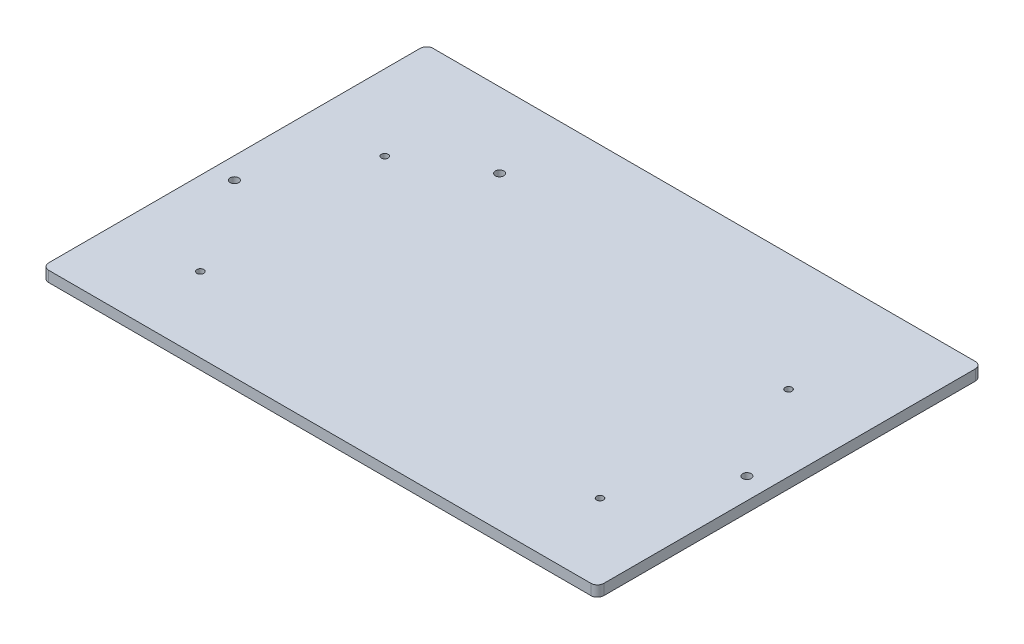
ISO-10303-21;
HEADER;
FILE_DESCRIPTION(('STEP AP214'),'2;1');
FILE_NAME('part.step','',(''),(''),'','','');
FILE_SCHEMA(('AUTOMOTIVE_DESIGN { 1 0 10303 214 1 1 1 1 }'));
ENDSEC;
DATA;
#1=APPLICATION_CONTEXT('core data for automotive mechanical design processes');
#2=APPLICATION_PROTOCOL_DEFINITION('international standard','automotive_design',2000,#1);
#3=PRODUCT_CONTEXT('',#1,'mechanical');
#4=PRODUCT('Part','Part','',(#3));
#5=PRODUCT_RELATED_PRODUCT_CATEGORY('part','',(#4));
#6=PRODUCT_DEFINITION_FORMATION('','',#4);
#7=PRODUCT_DEFINITION_CONTEXT('part definition',#1,'design');
#8=PRODUCT_DEFINITION('design','',#6,#7);
#9=PRODUCT_DEFINITION_SHAPE('','',#8);
#10=(LENGTH_UNIT() NAMED_UNIT(*) SI_UNIT(.MILLI.,.METRE.));
#11=(NAMED_UNIT(*) PLANE_ANGLE_UNIT() SI_UNIT($,.RADIAN.));
#12=(NAMED_UNIT(*) SI_UNIT($,.STERADIAN.) SOLID_ANGLE_UNIT());
#13=UNCERTAINTY_MEASURE_WITH_UNIT(LENGTH_MEASURE(1.E-05),#10,'distance_accuracy_value','');
#14=(GEOMETRIC_REPRESENTATION_CONTEXT(3) GLOBAL_UNCERTAINTY_ASSIGNED_CONTEXT((#13)) GLOBAL_UNIT_ASSIGNED_CONTEXT((#10,
#11,#12)) REPRESENTATION_CONTEXT('',''));
#15=CARTESIAN_POINT('',(0.,0.,0.));
#16=DIRECTION('',(0.,0.,1.));
#17=DIRECTION('',(1.,0.,0.));
#18=AXIS2_PLACEMENT_3D('',#15,#16,#17);
#19=CARTESIAN_POINT('',(0.,5.,0.));
#20=DIRECTION('',(0.,1.,0.));
#21=DIRECTION('',(0.,0.,1.));
#22=AXIS2_PLACEMENT_3D('',#19,#20,#21);
#23=PLANE('',#22);
#24=CARTESIAN_POINT('',(-114.970238095238,5.,35.8827774203236));
#25=DIRECTION('',(0.,1.,0.));
#26=DIRECTION('',(0.,0.,1.));
#27=AXIS2_PLACEMENT_3D('',#24,#25,#26);
#28=CIRCLE('',#27,2.);
#29=CARTESIAN_POINT('',(-114.970238095238,5.,37.8827774203236));
#30=VERTEX_POINT('',#29);
#31=EDGE_CURVE('E206',#30,#30,#28,.T.);
#32=ORIENTED_EDGE('',*,*,#31,.F.);
#33=EDGE_LOOP('',(#32));
#34=FACE_BOUND('',#33,.T.);
#35=CARTESIAN_POINT('',(99.5797619047619,5.,79.2000915178569));
#36=DIRECTION('',(0.,1.,0.));
#37=DIRECTION('',(0.,0.,1.));
#38=AXIS2_PLACEMENT_3D('',#35,#36,#37);
#39=CIRCLE('',#38,1.60000000000001);
#40=CARTESIAN_POINT('',(99.5797619047619,5.,80.8000915178569));
#41=VERTEX_POINT('',#40);
#42=EDGE_CURVE('E194',#41,#41,#39,.T.);
#43=ORIENTED_EDGE('',*,*,#42,.F.);
#44=EDGE_LOOP('',(#43));
#45=FACE_BOUND('',#44,.T.);
#46=CARTESIAN_POINT('',(99.5797619047619,5.,-9.07722257967636));
#47=DIRECTION('',(0.,1.,0.));
#48=DIRECTION('',(0.,0.,1.));
#49=AXIS2_PLACEMENT_3D('',#46,#47,#48);
#50=CIRCLE('',#49,1.6);
#51=CARTESIAN_POINT('',(99.5797619047619,5.,-7.47722257967636));
#52=VERTEX_POINT('',#51);
#53=EDGE_CURVE('E183',#52,#52,#50,.T.);
#54=ORIENTED_EDGE('',*,*,#53,.F.);
#55=EDGE_LOOP('',(#54));
#56=FACE_BOUND('',#55,.T.);
#57=DIRECTION('',(-1.,0.,0.));
#58=VECTOR('',#57,1.);
#59=CARTESIAN_POINT('',(-124.970238095238,5.,-64.1172225796764));
#60=LINE('',#59,#58);
#61=CARTESIAN_POINT('',(132.029761904762,5.,-64.1172225796764));
#62=VERTEX_POINT('',#61);
#63=CARTESIAN_POINT('',(-121.970238095238,5.,-64.1172225796764));
#64=VERTEX_POINT('',#63);
#65=EDGE_CURVE('E138',#62,#64,#60,.T.);
#66=ORIENTED_EDGE('',*,*,#65,.T.);
#67=CARTESIAN_POINT('',(-121.970238095238,5.,-61.1172225796764));
#68=DIRECTION('',(0.,1.,0.));
#69=DIRECTION('',(0.,0.,1.));
#70=AXIS2_PLACEMENT_3D('',#67,#68,#69);
#71=CIRCLE('',#70,3.);
#72=CARTESIAN_POINT('',(-124.970238095238,5.,-61.1172225796764));
#73=VERTEX_POINT('',#72);
#74=EDGE_CURVE('E157',#64,#73,#71,.T.);
#75=ORIENTED_EDGE('',*,*,#74,.T.);
#76=DIRECTION('',(0.,0.,1.));
#77=VECTOR('',#76,1.);
#78=CARTESIAN_POINT('',(-124.970238095238,5.,-64.1172225796764));
#79=LINE('',#78,#77);
#80=CARTESIAN_POINT('',(-124.970238095238,5.,112.882777420324));
#81=VERTEX_POINT('',#80);
#82=EDGE_CURVE('E121',#73,#81,#79,.T.);
#83=ORIENTED_EDGE('',*,*,#82,.T.);
#84=CARTESIAN_POINT('',(-121.970238095238,5.,112.882777420324));
#85=DIRECTION('',(0.,1.,0.));
#86=DIRECTION('',(0.,0.,1.));
#87=AXIS2_PLACEMENT_3D('',#84,#85,#86);
#88=CIRCLE('',#87,3.);
#89=CARTESIAN_POINT('',(-121.970238095238,5.,115.882777420324));
#90=VERTEX_POINT('',#89);
#91=EDGE_CURVE('E152',#81,#90,#88,.T.);
#92=ORIENTED_EDGE('',*,*,#91,.T.);
#93=DIRECTION('',(1.,0.,0.));
#94=VECTOR('',#93,1.);
#95=CARTESIAN_POINT('',(-124.970238095238,5.,115.882777420324));
#96=LINE('',#95,#94);
#97=CARTESIAN_POINT('',(132.029761904762,5.,115.882777420324));
#98=VERTEX_POINT('',#97);
#99=EDGE_CURVE('E168',#90,#98,#96,.T.);
#100=ORIENTED_EDGE('',*,*,#99,.T.);
#101=CARTESIAN_POINT('',(132.029761904762,5.,112.882777420324));
#102=DIRECTION('',(0.,1.,0.));
#103=DIRECTION('',(0.,0.,1.));
#104=AXIS2_PLACEMENT_3D('',#101,#102,#103);
#105=CIRCLE('',#104,3.);
#106=CARTESIAN_POINT('',(135.029761904762,5.,112.882777420324));
#107=VERTEX_POINT('',#106);
#108=EDGE_CURVE('E57',#98,#107,#105,.T.);
#109=ORIENTED_EDGE('',*,*,#108,.T.);
#110=DIRECTION('',(0.,0.,-1.));
#111=VECTOR('',#110,1.);
#112=CARTESIAN_POINT('',(135.029761904762,5.,-64.1172225796764));
#113=LINE('',#112,#111);
#114=CARTESIAN_POINT('',(135.029761904762,5.,-61.1172225796764));
#115=VERTEX_POINT('',#114);
#116=EDGE_CURVE('E176',#107,#115,#113,.T.);
#117=ORIENTED_EDGE('',*,*,#116,.T.);
#118=CARTESIAN_POINT('',(132.029761904762,5.,-61.1172225796764));
#119=DIRECTION('',(0.,1.,0.));
#120=DIRECTION('',(0.,0.,1.));
#121=AXIS2_PLACEMENT_3D('',#118,#119,#120);
#122=CIRCLE('',#121,3.);
#123=EDGE_CURVE('E155',#115,#62,#122,.T.);
#124=ORIENTED_EDGE('',*,*,#123,.T.);
#125=EDGE_LOOP('',(#66,#75,#83,#92,#100,#109,#117,#124));
#126=FACE_BOUND('',#125,.T.);
#127=CARTESIAN_POINT('',(-89.5202380952381,5.,-9.07722257967636));
#128=DIRECTION('',(0.,1.,0.));
#129=DIRECTION('',(0.,0.,1.));
#130=AXIS2_PLACEMENT_3D('',#127,#128,#129);
#131=CIRCLE('',#130,1.6);
#132=CARTESIAN_POINT('',(-89.5202380952381,5.,-7.47722257967636));
#133=VERTEX_POINT('',#132);
#134=EDGE_CURVE('E129',#133,#133,#131,.T.);
#135=ORIENTED_EDGE('',*,*,#134,.F.);
#136=EDGE_LOOP('',(#135));
#137=FACE_BOUND('',#136,.T.);
#138=CARTESIAN_POINT('',(-85.9302380952381,5.,80.8427774203236));
#139=DIRECTION('',(0.,1.,0.));
#140=DIRECTION('',(0.,0.,1.));
#141=AXIS2_PLACEMENT_3D('',#138,#139,#140);
#142=CIRCLE('',#141,1.60000000000001);
#143=CARTESIAN_POINT('',(-85.9302380952381,5.,82.4427774203237));
#144=VERTEX_POINT('',#143);
#145=EDGE_CURVE('E188',#144,#144,#142,.T.);
#146=ORIENTED_EDGE('',*,*,#145,.F.);
#147=EDGE_LOOP('',(#146));
#148=FACE_BOUND('',#147,.T.);
#149=CARTESIAN_POINT('',(-55.6396803922752,5.,-28.9873915760612));
#150=DIRECTION('',(0.,1.,0.));
#151=DIRECTION('',(0.,0.,1.));
#152=AXIS2_PLACEMENT_3D('',#149,#150,#151);
#153=CIRCLE('',#152,2.);
#154=CARTESIAN_POINT('',(-55.6396803922752,5.,-26.9873915760612));
#155=VERTEX_POINT('',#154);
#156=EDGE_CURVE('E200',#155,#155,#153,.T.);
#157=ORIENTED_EDGE('',*,*,#156,.F.);
#158=EDGE_LOOP('',(#157));
#159=FACE_BOUND('',#158,.T.);
#160=CARTESIAN_POINT('',(125.029761904762,5.,35.8827774203236));
#161=DIRECTION('',(0.,1.,0.));
#162=DIRECTION('',(0.,0.,1.));
#163=AXIS2_PLACEMENT_3D('',#160,#161,#162);
#164=CIRCLE('',#163,2.);
#165=CARTESIAN_POINT('',(125.029761904762,5.,37.8827774203236));
#166=VERTEX_POINT('',#165);
#167=EDGE_CURVE('E212',#166,#166,#164,.T.);
#168=ORIENTED_EDGE('',*,*,#167,.F.);
#169=EDGE_LOOP('',(#168));
#170=FACE_BOUND('',#169,.T.);
#171=ADVANCED_FACE('F35',(#34,#45,#56,#126,#137,#148,#159,#170),#23,.T.);
#172=CARTESIAN_POINT('',(0.,0.,0.));
#173=DIRECTION('',(0.,1.,0.));
#174=DIRECTION('',(0.,0.,1.));
#175=AXIS2_PLACEMENT_3D('',#172,#173,#174);
#176=PLANE('',#175);
#177=DIRECTION('',(0.,0.,1.));
#178=VECTOR('',#177,1.);
#179=CARTESIAN_POINT('',(-124.970238095238,0.,-64.1172225796764));
#180=LINE('',#179,#178);
#181=CARTESIAN_POINT('',(-124.970238095238,0.,-61.1172225796764));
#182=VERTEX_POINT('',#181);
#183=CARTESIAN_POINT('',(-124.970238095238,0.,112.882777420324));
#184=VERTEX_POINT('',#183);
#185=EDGE_CURVE('E118',#182,#184,#180,.T.);
#186=ORIENTED_EDGE('',*,*,#185,.F.);
#187=CARTESIAN_POINT('',(-121.970238095238,0.,-61.1172225796764));
#188=DIRECTION('',(0.,1.,0.));
#189=DIRECTION('',(0.,0.,1.));
#190=AXIS2_PLACEMENT_3D('',#187,#188,#189);
#191=CIRCLE('',#190,3.);
#192=CARTESIAN_POINT('',(-121.970238095238,0.,-64.1172225796764));
#193=VERTEX_POINT('',#192);
#194=EDGE_CURVE('E101',#182,#193,#191,.F.);
#195=ORIENTED_EDGE('',*,*,#194,.T.);
#196=DIRECTION('',(-1.,0.,0.));
#197=VECTOR('',#196,1.);
#198=CARTESIAN_POINT('',(-124.970238095238,0.,-64.1172225796764));
#199=LINE('',#198,#197);
#200=CARTESIAN_POINT('',(132.029761904762,0.,-64.1172225796764));
#201=VERTEX_POINT('',#200);
#202=EDGE_CURVE('E142',#201,#193,#199,.T.);
#203=ORIENTED_EDGE('',*,*,#202,.F.);
#204=CARTESIAN_POINT('',(132.029761904762,0.,-61.1172225796764));
#205=DIRECTION('',(0.,1.,0.));
#206=DIRECTION('',(0.,0.,1.));
#207=AXIS2_PLACEMENT_3D('',#204,#205,#206);
#208=CIRCLE('',#207,3.);
#209=CARTESIAN_POINT('',(135.029761904762,0.,-61.1172225796764));
#210=VERTEX_POINT('',#209);
#211=EDGE_CURVE('E112',#201,#210,#208,.F.);
#212=ORIENTED_EDGE('',*,*,#211,.T.);
#213=DIRECTION('',(0.,0.,-1.));
#214=VECTOR('',#213,1.);
#215=CARTESIAN_POINT('',(135.029761904762,0.,-64.1172225796764));
#216=LINE('',#215,#214);
#217=CARTESIAN_POINT('',(135.029761904762,0.,112.882777420324));
#218=VERTEX_POINT('',#217);
#219=EDGE_CURVE('E132',#218,#210,#216,.T.);
#220=ORIENTED_EDGE('',*,*,#219,.F.);
#221=CARTESIAN_POINT('',(132.029761904762,0.,112.882777420324));
#222=DIRECTION('',(0.,1.,0.));
#223=DIRECTION('',(0.,0.,1.));
#224=AXIS2_PLACEMENT_3D('',#221,#222,#223);
#225=CIRCLE('',#224,3.);
#226=CARTESIAN_POINT('',(132.029761904762,0.,115.882777420324));
#227=VERTEX_POINT('',#226);
#228=EDGE_CURVE('E146',#218,#227,#225,.F.);
#229=ORIENTED_EDGE('',*,*,#228,.T.);
#230=DIRECTION('',(1.,0.,0.));
#231=VECTOR('',#230,1.);
#232=CARTESIAN_POINT('',(-124.970238095238,0.,115.882777420324));
#233=LINE('',#232,#231);
#234=CARTESIAN_POINT('',(-121.970238095238,0.,115.882777420324));
#235=VERTEX_POINT('',#234);
#236=EDGE_CURVE('E128',#235,#227,#233,.T.);
#237=ORIENTED_EDGE('',*,*,#236,.F.);
#238=CARTESIAN_POINT('',(-121.970238095238,0.,112.882777420324));
#239=DIRECTION('',(0.,1.,0.));
#240=DIRECTION('',(0.,0.,1.));
#241=AXIS2_PLACEMENT_3D('',#238,#239,#240);
#242=CIRCLE('',#241,3.);
#243=EDGE_CURVE('E122',#235,#184,#242,.F.);
#244=ORIENTED_EDGE('',*,*,#243,.T.);
#245=EDGE_LOOP('',(#186,#195,#203,#212,#220,#229,#237,#244));
#246=FACE_BOUND('',#245,.T.);
#247=CARTESIAN_POINT('',(-89.5202380952381,0.,-9.07722257967636));
#248=DIRECTION('',(0.,1.,0.));
#249=DIRECTION('',(0.,0.,1.));
#250=AXIS2_PLACEMENT_3D('',#247,#248,#249);
#251=CIRCLE('',#250,1.6);
#252=CARTESIAN_POINT('',(-89.5202380952381,0.,-7.47722257967636));
#253=VERTEX_POINT('',#252);
#254=EDGE_CURVE('E135',#253,#253,#251,.T.);
#255=ORIENTED_EDGE('',*,*,#254,.T.);
#256=EDGE_LOOP('',(#255));
#257=FACE_BOUND('',#256,.T.);
#258=CARTESIAN_POINT('',(99.5797619047619,0.,-9.07722257967636));
#259=DIRECTION('',(0.,1.,0.));
#260=DIRECTION('',(0.,0.,1.));
#261=AXIS2_PLACEMENT_3D('',#258,#259,#260);
#262=CIRCLE('',#261,1.6);
#263=CARTESIAN_POINT('',(99.5797619047619,0.,-7.47722257967636));
#264=VERTEX_POINT('',#263);
#265=EDGE_CURVE('E185',#264,#264,#262,.T.);
#266=ORIENTED_EDGE('',*,*,#265,.T.);
#267=EDGE_LOOP('',(#266));
#268=FACE_BOUND('',#267,.T.);
#269=CARTESIAN_POINT('',(-85.9302380952381,0.,80.8427774203236));
#270=DIRECTION('',(0.,1.,0.));
#271=DIRECTION('',(0.,0.,1.));
#272=AXIS2_PLACEMENT_3D('',#269,#270,#271);
#273=CIRCLE('',#272,1.60000000000001);
#274=CARTESIAN_POINT('',(-85.9302380952381,0.,82.4427774203237));
#275=VERTEX_POINT('',#274);
#276=EDGE_CURVE('E191',#275,#275,#273,.T.);
#277=ORIENTED_EDGE('',*,*,#276,.T.);
#278=EDGE_LOOP('',(#277));
#279=FACE_BOUND('',#278,.T.);
#280=CARTESIAN_POINT('',(99.5797619047619,0.,79.2000915178569));
#281=DIRECTION('',(0.,1.,0.));
#282=DIRECTION('',(0.,0.,1.));
#283=AXIS2_PLACEMENT_3D('',#280,#281,#282);
#284=CIRCLE('',#283,1.60000000000001);
#285=CARTESIAN_POINT('',(99.5797619047619,0.,80.8000915178569));
#286=VERTEX_POINT('',#285);
#287=EDGE_CURVE('E197',#286,#286,#284,.T.);
#288=ORIENTED_EDGE('',*,*,#287,.T.);
#289=EDGE_LOOP('',(#288));
#290=FACE_BOUND('',#289,.T.);
#291=CARTESIAN_POINT('',(-55.6396803922752,0.,-28.9873915760612));
#292=DIRECTION('',(0.,1.,0.));
#293=DIRECTION('',(0.,0.,1.));
#294=AXIS2_PLACEMENT_3D('',#291,#292,#293);
#295=CIRCLE('',#294,2.);
#296=CARTESIAN_POINT('',(-55.6396803922752,0.,-26.9873915760612));
#297=VERTEX_POINT('',#296);
#298=EDGE_CURVE('E203',#297,#297,#295,.T.);
#299=ORIENTED_EDGE('',*,*,#298,.T.);
#300=EDGE_LOOP('',(#299));
#301=FACE_BOUND('',#300,.T.);
#302=CARTESIAN_POINT('',(-114.970238095238,0.,35.8827774203236));
#303=DIRECTION('',(0.,1.,0.));
#304=DIRECTION('',(0.,0.,1.));
#305=AXIS2_PLACEMENT_3D('',#302,#303,#304);
#306=CIRCLE('',#305,2.);
#307=CARTESIAN_POINT('',(-114.970238095238,0.,37.8827774203236));
#308=VERTEX_POINT('',#307);
#309=EDGE_CURVE('E209',#308,#308,#306,.T.);
#310=ORIENTED_EDGE('',*,*,#309,.T.);
#311=EDGE_LOOP('',(#310));
#312=FACE_BOUND('',#311,.T.);
#313=CARTESIAN_POINT('',(125.029761904762,0.,35.8827774203236));
#314=DIRECTION('',(0.,1.,0.));
#315=DIRECTION('',(0.,0.,1.));
#316=AXIS2_PLACEMENT_3D('',#313,#314,#315);
#317=CIRCLE('',#316,2.);
#318=CARTESIAN_POINT('',(125.029761904762,0.,37.8827774203236));
#319=VERTEX_POINT('',#318);
#320=EDGE_CURVE('E215',#319,#319,#317,.T.);
#321=ORIENTED_EDGE('',*,*,#320,.T.);
#322=EDGE_LOOP('',(#321));
#323=FACE_BOUND('',#322,.T.);
#324=ADVANCED_FACE('F125',(#246,#257,#268,#279,#290,#301,#312,#323),#176,.F.);
#325=CARTESIAN_POINT('',(-124.970238095238,5.,-64.1172225796764));
#326=DIRECTION('',(1.,0.,0.));
#327=DIRECTION('',(0.,0.,-1.));
#328=AXIS2_PLACEMENT_3D('',#325,#326,#327);
#329=PLANE('',#328);
#330=ORIENTED_EDGE('',*,*,#82,.F.);
#331=DIRECTION('',(0.,-1.,0.));
#332=VECTOR('',#331,1.);
#333=CARTESIAN_POINT('',(-124.970238095238,5.,-61.1172225796764));
#334=LINE('',#333,#332);
#335=EDGE_CURVE('E105',#73,#182,#334,.T.);
#336=ORIENTED_EDGE('',*,*,#335,.T.);
#337=ORIENTED_EDGE('',*,*,#185,.T.);
#338=DIRECTION('',(0.,-1.,0.));
#339=VECTOR('',#338,1.);
#340=CARTESIAN_POINT('',(-124.970238095238,5.,112.882777420324));
#341=LINE('',#340,#339);
#342=EDGE_CURVE('E123',#184,#81,#341,.F.);
#343=ORIENTED_EDGE('',*,*,#342,.T.);
#344=EDGE_LOOP('',(#330,#336,#337,#343));
#345=FACE_BOUND('',#344,.T.);
#346=ADVANCED_FACE('F117',(#345),#329,.F.);
#347=CARTESIAN_POINT('',(-124.970238095238,5.,115.882777420324));
#348=DIRECTION('',(0.,0.,-1.));
#349=DIRECTION('',(-1.,0.,0.));
#350=AXIS2_PLACEMENT_3D('',#347,#348,#349);
#351=PLANE('',#350);
#352=ORIENTED_EDGE('',*,*,#236,.T.);
#353=DIRECTION('',(0.,-1.,0.));
#354=VECTOR('',#353,1.);
#355=CARTESIAN_POINT('',(132.029761904762,5.,115.882777420324));
#356=LINE('',#355,#354);
#357=EDGE_CURVE('E11',#227,#98,#356,.F.);
#358=ORIENTED_EDGE('',*,*,#357,.T.);
#359=ORIENTED_EDGE('',*,*,#99,.F.);
#360=DIRECTION('',(0.,-1.,0.));
#361=VECTOR('',#360,1.);
#362=CARTESIAN_POINT('',(-121.970238095238,5.,115.882777420324));
#363=LINE('',#362,#361);
#364=EDGE_CURVE('E43',#90,#235,#363,.T.);
#365=ORIENTED_EDGE('',*,*,#364,.T.);
#366=EDGE_LOOP('',(#352,#358,#359,#365));
#367=FACE_BOUND('',#366,.T.);
#368=ADVANCED_FACE('F166',(#367),#351,.F.);
#369=CARTESIAN_POINT('',(135.029761904762,5.,-64.1172225796764));
#370=DIRECTION('',(-1.,0.,0.));
#371=DIRECTION('',(0.,0.,1.));
#372=AXIS2_PLACEMENT_3D('',#369,#370,#371);
#373=PLANE('',#372);
#374=ORIENTED_EDGE('',*,*,#219,.T.);
#375=DIRECTION('',(0.,-1.,0.));
#376=VECTOR('',#375,1.);
#377=CARTESIAN_POINT('',(135.029761904762,5.,-61.1172225796764));
#378=LINE('',#377,#376);
#379=EDGE_CURVE('E50',#210,#115,#378,.F.);
#380=ORIENTED_EDGE('',*,*,#379,.T.);
#381=ORIENTED_EDGE('',*,*,#116,.F.);
#382=DIRECTION('',(0.,-1.,0.));
#383=VECTOR('',#382,1.);
#384=CARTESIAN_POINT('',(135.029761904762,5.,112.882777420324));
#385=LINE('',#384,#383);
#386=EDGE_CURVE('E159',#107,#218,#385,.T.);
#387=ORIENTED_EDGE('',*,*,#386,.T.);
#388=EDGE_LOOP('',(#374,#380,#381,#387));
#389=FACE_BOUND('',#388,.T.);
#390=ADVANCED_FACE('F175',(#389),#373,.F.);
#391=CARTESIAN_POINT('',(-124.970238095238,5.,-64.1172225796764));
#392=DIRECTION('',(0.,0.,1.));
#393=DIRECTION('',(1.,0.,0.));
#394=AXIS2_PLACEMENT_3D('',#391,#392,#393);
#395=PLANE('',#394);
#396=ORIENTED_EDGE('',*,*,#202,.T.);
#397=DIRECTION('',(0.,-1.,0.));
#398=VECTOR('',#397,1.);
#399=CARTESIAN_POINT('',(-121.970238095238,5.,-64.1172225796764));
#400=LINE('',#399,#398);
#401=EDGE_CURVE('E106',#193,#64,#400,.F.);
#402=ORIENTED_EDGE('',*,*,#401,.T.);
#403=ORIENTED_EDGE('',*,*,#65,.F.);
#404=DIRECTION('',(0.,-1.,0.));
#405=VECTOR('',#404,1.);
#406=CARTESIAN_POINT('',(132.029761904762,5.,-64.1172225796764));
#407=LINE('',#406,#405);
#408=EDGE_CURVE('E111',#62,#201,#407,.T.);
#409=ORIENTED_EDGE('',*,*,#408,.T.);
#410=EDGE_LOOP('',(#396,#402,#403,#409));
#411=FACE_BOUND('',#410,.T.);
#412=ADVANCED_FACE('F237',(#411),#395,.F.);
#413=CARTESIAN_POINT('',(-89.5202380952381,5.,-9.07722257967636));
#414=DIRECTION('',(0.,-1.,0.));
#415=DIRECTION('',(0.,0.,-1.));
#416=AXIS2_PLACEMENT_3D('',#413,#414,#415);
#417=CYLINDRICAL_SURFACE('',#416,1.6);
#418=ORIENTED_EDGE('',*,*,#134,.T.);
#419=EDGE_LOOP('',(#418));
#420=FACE_BOUND('',#419,.T.);
#421=ORIENTED_EDGE('',*,*,#254,.F.);
#422=EDGE_LOOP('',(#421));
#423=FACE_BOUND('',#422,.T.);
#424=ADVANCED_FACE('F234',(#420,#423),#417,.F.);
#425=CARTESIAN_POINT('',(99.5797619047619,5.,-9.07722257967636));
#426=DIRECTION('',(0.,-1.,0.));
#427=DIRECTION('',(0.,0.,-1.));
#428=AXIS2_PLACEMENT_3D('',#425,#426,#427);
#429=CYLINDRICAL_SURFACE('',#428,1.6);
#430=ORIENTED_EDGE('',*,*,#53,.T.);
#431=EDGE_LOOP('',(#430));
#432=FACE_BOUND('',#431,.T.);
#433=ORIENTED_EDGE('',*,*,#265,.F.);
#434=EDGE_LOOP('',(#433));
#435=FACE_BOUND('',#434,.T.);
#436=ADVANCED_FACE('F292',(#432,#435),#429,.F.);
#437=CARTESIAN_POINT('',(-85.9302380952381,5.,80.8427774203236));
#438=DIRECTION('',(0.,-1.,0.));
#439=DIRECTION('',(0.,0.,-1.));
#440=AXIS2_PLACEMENT_3D('',#437,#438,#439);
#441=CYLINDRICAL_SURFACE('',#440,1.60000000000001);
#442=ORIENTED_EDGE('',*,*,#145,.T.);
#443=EDGE_LOOP('',(#442));
#444=FACE_BOUND('',#443,.T.);
#445=ORIENTED_EDGE('',*,*,#276,.F.);
#446=EDGE_LOOP('',(#445));
#447=FACE_BOUND('',#446,.T.);
#448=ADVANCED_FACE('F289',(#444,#447),#441,.F.);
#449=CARTESIAN_POINT('',(99.5797619047619,5.,79.2000915178569));
#450=DIRECTION('',(0.,-1.,0.));
#451=DIRECTION('',(0.,0.,-1.));
#452=AXIS2_PLACEMENT_3D('',#449,#450,#451);
#453=CYLINDRICAL_SURFACE('',#452,1.60000000000001);
#454=ORIENTED_EDGE('',*,*,#42,.T.);
#455=EDGE_LOOP('',(#454));
#456=FACE_BOUND('',#455,.T.);
#457=ORIENTED_EDGE('',*,*,#287,.F.);
#458=EDGE_LOOP('',(#457));
#459=FACE_BOUND('',#458,.T.);
#460=ADVANCED_FACE('F271',(#456,#459),#453,.F.);
#461=CARTESIAN_POINT('',(-55.6396803922752,5.,-28.9873915760612));
#462=DIRECTION('',(0.,-1.,0.));
#463=DIRECTION('',(0.,0.,-1.));
#464=AXIS2_PLACEMENT_3D('',#461,#462,#463);
#465=CYLINDRICAL_SURFACE('',#464,2.);
#466=ORIENTED_EDGE('',*,*,#156,.T.);
#467=EDGE_LOOP('',(#466));
#468=FACE_BOUND('',#467,.T.);
#469=ORIENTED_EDGE('',*,*,#298,.F.);
#470=EDGE_LOOP('',(#469));
#471=FACE_BOUND('',#470,.T.);
#472=ADVANCED_FACE('F267',(#468,#471),#465,.F.);
#473=CARTESIAN_POINT('',(-114.970238095238,5.,35.8827774203236));
#474=DIRECTION('',(0.,-1.,0.));
#475=DIRECTION('',(0.,0.,-1.));
#476=AXIS2_PLACEMENT_3D('',#473,#474,#475);
#477=CYLINDRICAL_SURFACE('',#476,2.);
#478=ORIENTED_EDGE('',*,*,#31,.T.);
#479=EDGE_LOOP('',(#478));
#480=FACE_BOUND('',#479,.T.);
#481=ORIENTED_EDGE('',*,*,#309,.F.);
#482=EDGE_LOOP('',(#481));
#483=FACE_BOUND('',#482,.T.);
#484=ADVANCED_FACE('F270',(#480,#483),#477,.F.);
#485=CARTESIAN_POINT('',(125.029761904762,5.,35.8827774203236));
#486=DIRECTION('',(0.,-1.,0.));
#487=DIRECTION('',(0.,0.,-1.));
#488=AXIS2_PLACEMENT_3D('',#485,#486,#487);
#489=CYLINDRICAL_SURFACE('',#488,2.);
#490=ORIENTED_EDGE('',*,*,#167,.T.);
#491=EDGE_LOOP('',(#490));
#492=FACE_BOUND('',#491,.T.);
#493=ORIENTED_EDGE('',*,*,#320,.F.);
#494=EDGE_LOOP('',(#493));
#495=FACE_BOUND('',#494,.T.);
#496=ADVANCED_FACE('F221',(#492,#495),#489,.F.);
#497=CARTESIAN_POINT('',(-121.970238095238,5.,-61.1172225796764));
#498=DIRECTION('',(0.,-1.,0.));
#499=DIRECTION('',(0.,0.,-1.));
#500=AXIS2_PLACEMENT_3D('',#497,#498,#499);
#501=CYLINDRICAL_SURFACE('',#500,3.);
#502=ORIENTED_EDGE('',*,*,#74,.F.);
#503=ORIENTED_EDGE('',*,*,#401,.F.);
#504=ORIENTED_EDGE('',*,*,#194,.F.);
#505=ORIENTED_EDGE('',*,*,#335,.F.);
#506=EDGE_LOOP('',(#502,#503,#504,#505));
#507=FACE_BOUND('',#506,.T.);
#508=ADVANCED_FACE('F104',(#507),#501,.T.);
#509=CARTESIAN_POINT('',(132.029761904762,5.,-61.1172225796764));
#510=DIRECTION('',(0.,-1.,0.));
#511=DIRECTION('',(0.,0.,-1.));
#512=AXIS2_PLACEMENT_3D('',#509,#510,#511);
#513=CYLINDRICAL_SURFACE('',#512,3.);
#514=ORIENTED_EDGE('',*,*,#123,.F.);
#515=ORIENTED_EDGE('',*,*,#379,.F.);
#516=ORIENTED_EDGE('',*,*,#211,.F.);
#517=ORIENTED_EDGE('',*,*,#408,.F.);
#518=EDGE_LOOP('',(#514,#515,#516,#517));
#519=FACE_BOUND('',#518,.T.);
#520=ADVANCED_FACE('F249',(#519),#513,.T.);
#521=CARTESIAN_POINT('',(132.029761904762,5.,112.882777420324));
#522=DIRECTION('',(0.,-1.,0.));
#523=DIRECTION('',(0.,0.,-1.));
#524=AXIS2_PLACEMENT_3D('',#521,#522,#523);
#525=CYLINDRICAL_SURFACE('',#524,3.);
#526=ORIENTED_EDGE('',*,*,#108,.F.);
#527=ORIENTED_EDGE('',*,*,#357,.F.);
#528=ORIENTED_EDGE('',*,*,#228,.F.);
#529=ORIENTED_EDGE('',*,*,#386,.F.);
#530=EDGE_LOOP('',(#526,#527,#528,#529));
#531=FACE_BOUND('',#530,.T.);
#532=ADVANCED_FACE('F174',(#531),#525,.T.);
#533=CARTESIAN_POINT('',(-121.970238095238,5.,112.882777420324));
#534=DIRECTION('',(0.,-1.,0.));
#535=DIRECTION('',(0.,0.,-1.));
#536=AXIS2_PLACEMENT_3D('',#533,#534,#535);
#537=CYLINDRICAL_SURFACE('',#536,3.);
#538=ORIENTED_EDGE('',*,*,#91,.F.);
#539=ORIENTED_EDGE('',*,*,#342,.F.);
#540=ORIENTED_EDGE('',*,*,#243,.F.);
#541=ORIENTED_EDGE('',*,*,#364,.F.);
#542=EDGE_LOOP('',(#538,#539,#540,#541));
#543=FACE_BOUND('',#542,.T.);
#544=ADVANCED_FACE('F37',(#543),#537,.T.);
#545=CLOSED_SHELL('',(#171,#324,#346,#368,#390,#412,#424,#436,#448,#460,#472,#484,#496,#508,
#520,#532,#544));
#546=MANIFOLD_SOLID_BREP('B2',#545);
#547=ADVANCED_BREP_SHAPE_REPRESENTATION('',(#18,#546),#14);
#548=SHAPE_DEFINITION_REPRESENTATION(#9,#547);
ENDSEC;
END-ISO-10303-21;
